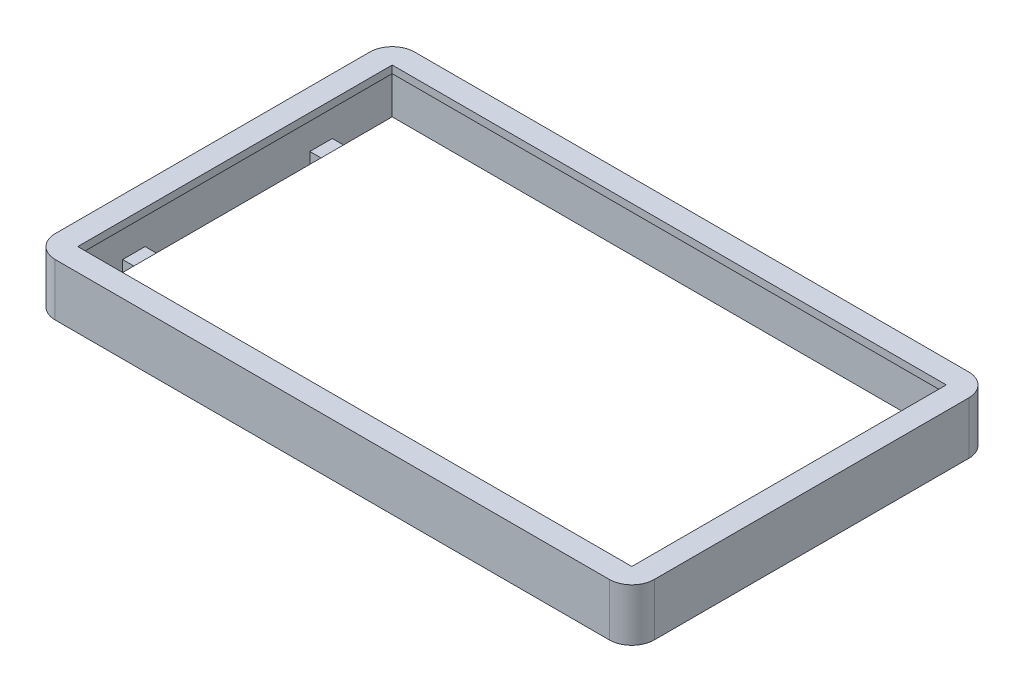
ISO-10303-21;
HEADER;
FILE_DESCRIPTION(('STEP AP214'),'2;1');
FILE_NAME('part.step','',(''),(''),'','','');
FILE_SCHEMA(('AUTOMOTIVE_DESIGN { 1 0 10303 214 1 1 1 1 }'));
ENDSEC;
DATA;
#1=APPLICATION_CONTEXT('core data for automotive mechanical design processes');
#2=APPLICATION_PROTOCOL_DEFINITION('international standard','automotive_design',2000,#1);
#3=PRODUCT_CONTEXT('',#1,'mechanical');
#4=PRODUCT('Part','Part','',(#3));
#5=PRODUCT_RELATED_PRODUCT_CATEGORY('part','',(#4));
#6=PRODUCT_DEFINITION_FORMATION('','',#4);
#7=PRODUCT_DEFINITION_CONTEXT('part definition',#1,'design');
#8=PRODUCT_DEFINITION('design','',#6,#7);
#9=PRODUCT_DEFINITION_SHAPE('','',#8);
#10=(LENGTH_UNIT() NAMED_UNIT(*) SI_UNIT(.MILLI.,.METRE.));
#11=(NAMED_UNIT(*) PLANE_ANGLE_UNIT() SI_UNIT($,.RADIAN.));
#12=(NAMED_UNIT(*) SI_UNIT($,.STERADIAN.) SOLID_ANGLE_UNIT());
#13=UNCERTAINTY_MEASURE_WITH_UNIT(LENGTH_MEASURE(1.E-05),#10,'distance_accuracy_value','');
#14=(GEOMETRIC_REPRESENTATION_CONTEXT(3) GLOBAL_UNCERTAINTY_ASSIGNED_CONTEXT((#13)) GLOBAL_UNIT_ASSIGNED_CONTEXT((#10,
#11,#12)) REPRESENTATION_CONTEXT('',''));
#15=CARTESIAN_POINT('',(0.,0.,0.));
#16=DIRECTION('',(0.,0.,1.));
#17=DIRECTION('',(1.,0.,0.));
#18=AXIS2_PLACEMENT_3D('',#15,#16,#17);
#19=CARTESIAN_POINT('',(0.,0.,0.));
#20=DIRECTION('',(0.,-1.,0.));
#21=DIRECTION('',(0.,0.,-1.));
#22=AXIS2_PLACEMENT_3D('',#19,#20,#21);
#23=PLANE('',#22);
#24=DIRECTION('',(-1.,0.,0.));
#25=VECTOR('',#24,1.);
#26=CARTESIAN_POINT('',(-40.,0.,-24.));
#27=LINE('',#26,#25);
#28=CARTESIAN_POINT('',(37.,0.,-24.));
#29=VERTEX_POINT('',#28);
#30=CARTESIAN_POINT('',(-37.,0.,-24.));
#31=VERTEX_POINT('',#30);
#32=EDGE_CURVE('E498',#29,#31,#27,.T.);
#33=ORIENTED_EDGE('',*,*,#32,.F.);
#34=CARTESIAN_POINT('',(37.,0.,-21.));
#35=DIRECTION('',(0.,-1.,0.));
#36=DIRECTION('',(0.,0.,-1.));
#37=AXIS2_PLACEMENT_3D('',#34,#35,#36);
#38=CIRCLE('',#37,3.);
#39=CARTESIAN_POINT('',(40.,0.,-21.));
#40=VERTEX_POINT('',#39);
#41=EDGE_CURVE('E529',#29,#40,#38,.T.);
#42=ORIENTED_EDGE('',*,*,#41,.T.);
#43=DIRECTION('',(0.,0.,-1.));
#44=VECTOR('',#43,1.);
#45=CARTESIAN_POINT('',(40.,0.,-24.));
#46=LINE('',#45,#44);
#47=CARTESIAN_POINT('',(40.,0.,21.));
#48=VERTEX_POINT('',#47);
#49=EDGE_CURVE('E510',#48,#40,#46,.T.);
#50=ORIENTED_EDGE('',*,*,#49,.F.);
#51=CARTESIAN_POINT('',(37.,0.,21.));
#52=DIRECTION('',(0.,-1.,0.));
#53=DIRECTION('',(0.,0.,-1.));
#54=AXIS2_PLACEMENT_3D('',#51,#52,#53);
#55=CIRCLE('',#54,3.);
#56=CARTESIAN_POINT('',(37.,0.,24.));
#57=VERTEX_POINT('',#56);
#58=EDGE_CURVE('E526',#48,#57,#55,.T.);
#59=ORIENTED_EDGE('',*,*,#58,.T.);
#60=DIRECTION('',(1.,0.,0.));
#61=VECTOR('',#60,1.);
#62=CARTESIAN_POINT('',(-40.,0.,24.));
#63=LINE('',#62,#61);
#64=CARTESIAN_POINT('',(-37.,0.,24.));
#65=VERTEX_POINT('',#64);
#66=EDGE_CURVE('E506',#65,#57,#63,.T.);
#67=ORIENTED_EDGE('',*,*,#66,.F.);
#68=CARTESIAN_POINT('',(-37.,0.,21.));
#69=DIRECTION('',(0.,-1.,0.));
#70=DIRECTION('',(0.,0.,-1.));
#71=AXIS2_PLACEMENT_3D('',#68,#69,#70);
#72=CIRCLE('',#71,3.);
#73=CARTESIAN_POINT('',(-40.,0.,21.));
#74=VERTEX_POINT('',#73);
#75=EDGE_CURVE('E523',#65,#74,#72,.T.);
#76=ORIENTED_EDGE('',*,*,#75,.T.);
#77=DIRECTION('',(0.,0.,1.));
#78=VECTOR('',#77,1.);
#79=CARTESIAN_POINT('',(-40.,0.,-24.));
#80=LINE('',#79,#78);
#81=CARTESIAN_POINT('',(-40.,0.,-21.));
#82=VERTEX_POINT('',#81);
#83=EDGE_CURVE('E502',#82,#74,#80,.T.);
#84=ORIENTED_EDGE('',*,*,#83,.F.);
#85=CARTESIAN_POINT('',(-37.,0.,-21.));
#86=DIRECTION('',(0.,-1.,0.));
#87=DIRECTION('',(0.,0.,-1.));
#88=AXIS2_PLACEMENT_3D('',#85,#86,#87);
#89=CIRCLE('',#88,3.);
#90=EDGE_CURVE('E520',#82,#31,#89,.T.);
#91=ORIENTED_EDGE('',*,*,#90,.T.);
#92=EDGE_LOOP('',(#33,#42,#50,#59,#67,#76,#84,#91));
#93=FACE_BOUND('',#92,.T.);
#94=DIRECTION('',(1.,0.,0.));
#95=VECTOR('',#94,1.);
#96=CARTESIAN_POINT('',(-38.,0.,22.));
#97=LINE('',#96,#95);
#98=CARTESIAN_POINT('',(-21.,0.,22.));
#99=VERTEX_POINT('',#98);
#100=CARTESIAN_POINT('',(21.,0.,22.));
#101=VERTEX_POINT('',#100);
#102=EDGE_CURVE('E486',#99,#101,#97,.T.);
#103=ORIENTED_EDGE('',*,*,#102,.T.);
#104=DIRECTION('',(1.,0.,0.));
#105=VECTOR('',#104,1.);
#106=CARTESIAN_POINT('',(26.,0.,22.));
#107=LINE('',#106,#105);
#108=CARTESIAN_POINT('',(26.,0.,22.));
#109=VERTEX_POINT('',#108);
#110=EDGE_CURVE('E576',#101,#109,#107,.T.);
#111=ORIENTED_EDGE('',*,*,#110,.T.);
#112=CARTESIAN_POINT('',(38.,0.,22.));
#113=VERTEX_POINT('',#112);
#114=EDGE_CURVE('E481',#109,#113,#97,.T.);
#115=ORIENTED_EDGE('',*,*,#114,.T.);
#116=DIRECTION('',(0.,0.,-1.));
#117=VECTOR('',#116,1.);
#118=CARTESIAN_POINT('',(38.,0.,-22.));
#119=LINE('',#118,#117);
#120=CARTESIAN_POINT('',(38.,0.,-22.));
#121=VERTEX_POINT('',#120);
#122=EDGE_CURVE('E451',#113,#121,#119,.T.);
#123=ORIENTED_EDGE('',*,*,#122,.T.);
#124=DIRECTION('',(-1.,0.,0.));
#125=VECTOR('',#124,1.);
#126=CARTESIAN_POINT('',(-38.,0.,-22.));
#127=LINE('',#126,#125);
#128=CARTESIAN_POINT('',(-38.,0.,-22.));
#129=VERTEX_POINT('',#128);
#130=EDGE_CURVE('E473',#121,#129,#127,.T.);
#131=ORIENTED_EDGE('',*,*,#130,.T.);
#132=DIRECTION('',(0.,0.,1.));
#133=VECTOR('',#132,1.);
#134=CARTESIAN_POINT('',(-38.,0.,-22.));
#135=LINE('',#134,#133);
#136=CARTESIAN_POINT('',(-38.,0.,-14.));
#137=VERTEX_POINT('',#136);
#138=EDGE_CURVE('E478',#129,#137,#135,.T.);
#139=ORIENTED_EDGE('',*,*,#138,.T.);
#140=DIRECTION('',(0.,0.,1.));
#141=VECTOR('',#140,1.);
#142=CARTESIAN_POINT('',(-38.,0.,0.));
#143=LINE('',#142,#141);
#144=CARTESIAN_POINT('',(-38.,0.,-11.));
#145=VERTEX_POINT('',#144);
#146=EDGE_CURVE('E568',#137,#145,#143,.T.);
#147=ORIENTED_EDGE('',*,*,#146,.T.);
#148=CARTESIAN_POINT('',(-38.,0.,11.));
#149=VERTEX_POINT('',#148);
#150=EDGE_CURVE('E482',#145,#149,#135,.T.);
#151=ORIENTED_EDGE('',*,*,#150,.T.);
#152=DIRECTION('',(0.,0.,1.));
#153=VECTOR('',#152,1.);
#154=CARTESIAN_POINT('',(-38.,0.,14.));
#155=LINE('',#154,#153);
#156=CARTESIAN_POINT('',(-38.,0.,14.));
#157=VERTEX_POINT('',#156);
#158=EDGE_CURVE('E565',#149,#157,#155,.T.);
#159=ORIENTED_EDGE('',*,*,#158,.T.);
#160=CARTESIAN_POINT('',(-38.,0.,22.));
#161=VERTEX_POINT('',#160);
#162=EDGE_CURVE('E477',#157,#161,#135,.T.);
#163=ORIENTED_EDGE('',*,*,#162,.T.);
#164=CARTESIAN_POINT('',(-26.,0.,22.));
#165=VERTEX_POINT('',#164);
#166=EDGE_CURVE('E457',#161,#165,#97,.T.);
#167=ORIENTED_EDGE('',*,*,#166,.T.);
#168=DIRECTION('',(1.,0.,0.));
#169=VECTOR('',#168,1.);
#170=CARTESIAN_POINT('',(0.,0.,22.));
#171=LINE('',#170,#169);
#172=EDGE_CURVE('E572',#165,#99,#171,.T.);
#173=ORIENTED_EDGE('',*,*,#172,.T.);
#174=EDGE_LOOP('',(#103,#111,#115,#123,#131,#139,#147,#151,#159,#163,#167,#173));
#175=FACE_BOUND('',#174,.T.);
#176=ADVANCED_FACE('F169',(#93,#175),#23,.T.);
#177=CARTESIAN_POINT('',(-40.,6.,-24.));
#178=DIRECTION('',(0.,0.,1.));
#179=DIRECTION('',(1.,0.,0.));
#180=AXIS2_PLACEMENT_3D('',#177,#178,#179);
#181=PLANE('',#180);
#182=DIRECTION('',(0.,-1.,0.));
#183=VECTOR('',#182,1.);
#184=CARTESIAN_POINT('',(-37.,6.,-24.));
#185=LINE('',#184,#183);
#186=CARTESIAN_POINT('',(-37.,7.,-24.));
#187=VERTEX_POINT('',#186);
#188=EDGE_CURVE('E514',#31,#187,#185,.F.);
#189=ORIENTED_EDGE('',*,*,#188,.T.);
#190=DIRECTION('',(-1.,0.,0.));
#191=VECTOR('',#190,1.);
#192=CARTESIAN_POINT('',(40.,7.,-24.));
#193=LINE('',#192,#191);
#194=CARTESIAN_POINT('',(37.,7.,-24.));
#195=VERTEX_POINT('',#194);
#196=EDGE_CURVE('E439',#195,#187,#193,.T.);
#197=ORIENTED_EDGE('',*,*,#196,.F.);
#198=DIRECTION('',(0.,-1.,0.));
#199=VECTOR('',#198,1.);
#200=CARTESIAN_POINT('',(37.,6.,-24.));
#201=LINE('',#200,#199);
#202=EDGE_CURVE('E517',#195,#29,#201,.T.);
#203=ORIENTED_EDGE('',*,*,#202,.T.);
#204=ORIENTED_EDGE('',*,*,#32,.T.);
#205=EDGE_LOOP('',(#189,#197,#203,#204));
#206=FACE_BOUND('',#205,.T.);
#207=ADVANCED_FACE('F687',(#206),#181,.F.);
#208=CARTESIAN_POINT('',(-40.,6.,-24.));
#209=DIRECTION('',(1.,0.,0.));
#210=DIRECTION('',(0.,0.,-1.));
#211=AXIS2_PLACEMENT_3D('',#208,#209,#210);
#212=PLANE('',#211);
#213=DIRECTION('',(0.,-1.,0.));
#214=VECTOR('',#213,1.);
#215=CARTESIAN_POINT('',(-40.,6.,21.));
#216=LINE('',#215,#214);
#217=CARTESIAN_POINT('',(-40.,7.,21.));
#218=VERTEX_POINT('',#217);
#219=EDGE_CURVE('E559',#74,#218,#216,.F.);
#220=ORIENTED_EDGE('',*,*,#219,.T.);
#221=DIRECTION('',(0.,0.,1.));
#222=VECTOR('',#221,1.);
#223=CARTESIAN_POINT('',(-40.,7.,-24.));
#224=LINE('',#223,#222);
#225=CARTESIAN_POINT('',(-40.,7.,-21.));
#226=VERTEX_POINT('',#225);
#227=EDGE_CURVE('E443',#226,#218,#224,.T.);
#228=ORIENTED_EDGE('',*,*,#227,.F.);
#229=DIRECTION('',(0.,-1.,0.));
#230=VECTOR('',#229,1.);
#231=CARTESIAN_POINT('',(-40.,6.,-21.));
#232=LINE('',#231,#230);
#233=EDGE_CURVE('E556',#226,#82,#232,.T.);
#234=ORIENTED_EDGE('',*,*,#233,.T.);
#235=ORIENTED_EDGE('',*,*,#83,.T.);
#236=EDGE_LOOP('',(#220,#228,#234,#235));
#237=FACE_BOUND('',#236,.T.);
#238=ADVANCED_FACE('F695',(#237),#212,.F.);
#239=CARTESIAN_POINT('',(-40.,6.,24.));
#240=DIRECTION('',(0.,0.,-1.));
#241=DIRECTION('',(-1.,0.,0.));
#242=AXIS2_PLACEMENT_3D('',#239,#240,#241);
#243=PLANE('',#242);
#244=DIRECTION('',(0.,-1.,0.));
#245=VECTOR('',#244,1.);
#246=CARTESIAN_POINT('',(37.,6.,24.));
#247=LINE('',#246,#245);
#248=CARTESIAN_POINT('',(37.,7.,24.));
#249=VERTEX_POINT('',#248);
#250=EDGE_CURVE('E553',#57,#249,#247,.F.);
#251=ORIENTED_EDGE('',*,*,#250,.T.);
#252=DIRECTION('',(1.,0.,0.));
#253=VECTOR('',#252,1.);
#254=CARTESIAN_POINT('',(-40.,7.,24.));
#255=LINE('',#254,#253);
#256=CARTESIAN_POINT('',(-37.,7.,24.));
#257=VERTEX_POINT('',#256);
#258=EDGE_CURVE('E447',#257,#249,#255,.T.);
#259=ORIENTED_EDGE('',*,*,#258,.F.);
#260=DIRECTION('',(0.,-1.,0.));
#261=VECTOR('',#260,1.);
#262=CARTESIAN_POINT('',(-37.,6.,24.));
#263=LINE('',#262,#261);
#264=EDGE_CURVE('E550',#257,#65,#263,.T.);
#265=ORIENTED_EDGE('',*,*,#264,.T.);
#266=ORIENTED_EDGE('',*,*,#66,.T.);
#267=EDGE_LOOP('',(#251,#259,#265,#266));
#268=FACE_BOUND('',#267,.T.);
#269=ADVANCED_FACE('F706',(#268),#243,.F.);
#270=CARTESIAN_POINT('',(40.,6.,-24.));
#271=DIRECTION('',(-1.,0.,0.));
#272=DIRECTION('',(0.,0.,1.));
#273=AXIS2_PLACEMENT_3D('',#270,#271,#272);
#274=PLANE('',#273);
#275=DIRECTION('',(0.,-1.,0.));
#276=VECTOR('',#275,1.);
#277=CARTESIAN_POINT('',(40.,6.,-21.));
#278=LINE('',#277,#276);
#279=CARTESIAN_POINT('',(40.,7.,-21.));
#280=VERTEX_POINT('',#279);
#281=EDGE_CURVE('E535',#40,#280,#278,.F.);
#282=ORIENTED_EDGE('',*,*,#281,.T.);
#283=DIRECTION('',(0.,0.,-1.));
#284=VECTOR('',#283,1.);
#285=CARTESIAN_POINT('',(40.,7.,24.));
#286=LINE('',#285,#284);
#287=CARTESIAN_POINT('',(40.,7.,21.));
#288=VERTEX_POINT('',#287);
#289=EDGE_CURVE('E435',#288,#280,#286,.T.);
#290=ORIENTED_EDGE('',*,*,#289,.F.);
#291=DIRECTION('',(0.,-1.,0.));
#292=VECTOR('',#291,1.);
#293=CARTESIAN_POINT('',(40.,6.,21.));
#294=LINE('',#293,#292);
#295=EDGE_CURVE('E532',#288,#48,#294,.T.);
#296=ORIENTED_EDGE('',*,*,#295,.T.);
#297=ORIENTED_EDGE('',*,*,#49,.T.);
#298=EDGE_LOOP('',(#282,#290,#296,#297));
#299=FACE_BOUND('',#298,.T.);
#300=ADVANCED_FACE('F703',(#299),#274,.F.);
#301=CARTESIAN_POINT('',(38.,6.,-22.));
#302=DIRECTION('',(-1.,0.,0.));
#303=DIRECTION('',(0.,0.,1.));
#304=AXIS2_PLACEMENT_3D('',#301,#302,#303);
#305=PLANE('',#304);
#306=ORIENTED_EDGE('',*,*,#122,.F.);
#307=DIRECTION('',(0.,-1.,0.));
#308=VECTOR('',#307,1.);
#309=CARTESIAN_POINT('',(38.,6.,22.));
#310=LINE('',#309,#308);
#311=CARTESIAN_POINT('',(38.,6.,22.));
#312=VERTEX_POINT('',#311);
#313=EDGE_CURVE('E469',#312,#113,#310,.T.);
#314=ORIENTED_EDGE('',*,*,#313,.F.);
#315=DIRECTION('',(0.,0.,-1.));
#316=VECTOR('',#315,1.);
#317=CARTESIAN_POINT('',(38.,6.,-22.));
#318=LINE('',#317,#316);
#319=CARTESIAN_POINT('',(38.,6.,-22.));
#320=VERTEX_POINT('',#319);
#321=EDGE_CURVE('E452',#312,#320,#318,.T.);
#322=ORIENTED_EDGE('',*,*,#321,.T.);
#323=DIRECTION('',(0.,-1.,0.));
#324=VECTOR('',#323,1.);
#325=CARTESIAN_POINT('',(38.,6.,-22.));
#326=LINE('',#325,#324);
#327=EDGE_CURVE('E495',#320,#121,#326,.T.);
#328=ORIENTED_EDGE('',*,*,#327,.T.);
#329=EDGE_LOOP('',(#306,#314,#322,#328));
#330=FACE_BOUND('',#329,.T.);
#331=ADVANCED_FACE('F701',(#330),#305,.T.);
#332=CARTESIAN_POINT('',(-38.,6.,-22.));
#333=DIRECTION('',(0.,0.,1.));
#334=DIRECTION('',(1.,0.,0.));
#335=AXIS2_PLACEMENT_3D('',#332,#333,#334);
#336=PLANE('',#335);
#337=ORIENTED_EDGE('',*,*,#130,.F.);
#338=ORIENTED_EDGE('',*,*,#327,.F.);
#339=DIRECTION('',(-1.,0.,0.));
#340=VECTOR('',#339,1.);
#341=CARTESIAN_POINT('',(-38.,6.,-22.));
#342=LINE('',#341,#340);
#343=CARTESIAN_POINT('',(-38.,6.,-22.));
#344=VERTEX_POINT('',#343);
#345=EDGE_CURVE('E456',#320,#344,#342,.T.);
#346=ORIENTED_EDGE('',*,*,#345,.T.);
#347=DIRECTION('',(0.,-1.,0.));
#348=VECTOR('',#347,1.);
#349=CARTESIAN_POINT('',(-38.,6.,-22.));
#350=LINE('',#349,#348);
#351=EDGE_CURVE('E492',#344,#129,#350,.T.);
#352=ORIENTED_EDGE('',*,*,#351,.T.);
#353=EDGE_LOOP('',(#337,#338,#346,#352));
#354=FACE_BOUND('',#353,.T.);
#355=ADVANCED_FACE('F786',(#354),#336,.T.);
#356=CARTESIAN_POINT('',(-38.,6.,-22.));
#357=DIRECTION('',(1.,0.,0.));
#358=DIRECTION('',(0.,0.,-1.));
#359=AXIS2_PLACEMENT_3D('',#356,#357,#358);
#360=PLANE('',#359);
#361=ORIENTED_EDGE('',*,*,#138,.F.);
#362=ORIENTED_EDGE('',*,*,#351,.F.);
#363=DIRECTION('',(0.,0.,1.));
#364=VECTOR('',#363,1.);
#365=CARTESIAN_POINT('',(-38.,6.,-22.));
#366=LINE('',#365,#364);
#367=CARTESIAN_POINT('',(-38.,6.,22.));
#368=VERTEX_POINT('',#367);
#369=EDGE_CURVE('E461',#344,#368,#366,.T.);
#370=ORIENTED_EDGE('',*,*,#369,.T.);
#371=DIRECTION('',(0.,-1.,0.));
#372=VECTOR('',#371,1.);
#373=CARTESIAN_POINT('',(-38.,6.,22.));
#374=LINE('',#373,#372);
#375=EDGE_CURVE('E489',#368,#161,#374,.T.);
#376=ORIENTED_EDGE('',*,*,#375,.T.);
#377=ORIENTED_EDGE('',*,*,#162,.F.);
#378=DIRECTION('',(0.,-1.,0.));
#379=VECTOR('',#378,1.);
#380=CARTESIAN_POINT('',(-38.,1.5,14.));
#381=LINE('',#380,#379);
#382=CARTESIAN_POINT('',(-38.,1.5,14.));
#383=VERTEX_POINT('',#382);
#384=EDGE_CURVE('E607',#383,#157,#381,.T.);
#385=ORIENTED_EDGE('',*,*,#384,.F.);
#386=DIRECTION('',(0.,0.,-1.));
#387=VECTOR('',#386,1.);
#388=CARTESIAN_POINT('',(-38.,1.5,-22.));
#389=LINE('',#388,#387);
#390=CARTESIAN_POINT('',(-38.,1.5,11.));
#391=VERTEX_POINT('',#390);
#392=EDGE_CURVE('E382',#383,#391,#389,.T.);
#393=ORIENTED_EDGE('',*,*,#392,.T.);
#394=DIRECTION('',(0.,-1.,0.));
#395=VECTOR('',#394,1.);
#396=CARTESIAN_POINT('',(-38.,1.5,11.));
#397=LINE('',#396,#395);
#398=EDGE_CURVE('E597',#391,#149,#397,.T.);
#399=ORIENTED_EDGE('',*,*,#398,.T.);
#400=ORIENTED_EDGE('',*,*,#150,.F.);
#401=DIRECTION('',(0.,-1.,0.));
#402=VECTOR('',#401,1.);
#403=CARTESIAN_POINT('',(-38.,1.5,-11.));
#404=LINE('',#403,#402);
#405=CARTESIAN_POINT('',(-38.,1.5,-11.));
#406=VERTEX_POINT('',#405);
#407=EDGE_CURVE('E368',#406,#145,#404,.T.);
#408=ORIENTED_EDGE('',*,*,#407,.F.);
#409=CARTESIAN_POINT('',(-38.,1.5,-14.));
#410=VERTEX_POINT('',#409);
#411=EDGE_CURVE('E373',#406,#410,#389,.T.);
#412=ORIENTED_EDGE('',*,*,#411,.T.);
#413=DIRECTION('',(0.,-1.,0.));
#414=VECTOR('',#413,1.);
#415=CARTESIAN_POINT('',(-38.,1.5,-14.));
#416=LINE('',#415,#414);
#417=EDGE_CURVE('E357',#410,#137,#416,.T.);
#418=ORIENTED_EDGE('',*,*,#417,.T.);
#419=EDGE_LOOP('',(#361,#362,#370,#376,#377,#385,#393,#399,#400,#408,#412,#418));
#420=FACE_BOUND('',#419,.T.);
#421=ADVANCED_FACE('F379',(#420),#360,.T.);
#422=CARTESIAN_POINT('',(-38.,6.,22.));
#423=DIRECTION('',(0.,0.,-1.));
#424=DIRECTION('',(-1.,0.,0.));
#425=AXIS2_PLACEMENT_3D('',#422,#423,#424);
#426=PLANE('',#425);
#427=ORIENTED_EDGE('',*,*,#166,.F.);
#428=ORIENTED_EDGE('',*,*,#375,.F.);
#429=DIRECTION('',(1.,0.,0.));
#430=VECTOR('',#429,1.);
#431=CARTESIAN_POINT('',(-38.,6.,22.));
#432=LINE('',#431,#430);
#433=EDGE_CURVE('E465',#368,#312,#432,.T.);
#434=ORIENTED_EDGE('',*,*,#433,.T.);
#435=ORIENTED_EDGE('',*,*,#313,.T.);
#436=ORIENTED_EDGE('',*,*,#114,.F.);
#437=DIRECTION('',(0.,-1.,0.));
#438=VECTOR('',#437,1.);
#439=CARTESIAN_POINT('',(26.,1.5,22.));
#440=LINE('',#439,#438);
#441=CARTESIAN_POINT('',(26.,1.5,22.));
#442=VERTEX_POINT('',#441);
#443=EDGE_CURVE('E649',#442,#109,#440,.T.);
#444=ORIENTED_EDGE('',*,*,#443,.F.);
#445=DIRECTION('',(-1.,0.,0.));
#446=VECTOR('',#445,1.);
#447=CARTESIAN_POINT('',(-38.,1.5,22.));
#448=LINE('',#447,#446);
#449=CARTESIAN_POINT('',(21.,1.5,22.));
#450=VERTEX_POINT('',#449);
#451=EDGE_CURVE('E383',#442,#450,#448,.T.);
#452=ORIENTED_EDGE('',*,*,#451,.T.);
#453=DIRECTION('',(0.,-1.,0.));
#454=VECTOR('',#453,1.);
#455=CARTESIAN_POINT('',(21.,1.5,22.));
#456=LINE('',#455,#454);
#457=EDGE_CURVE('E653',#450,#101,#456,.T.);
#458=ORIENTED_EDGE('',*,*,#457,.T.);
#459=ORIENTED_EDGE('',*,*,#102,.F.);
#460=DIRECTION('',(0.,-1.,0.));
#461=VECTOR('',#460,1.);
#462=CARTESIAN_POINT('',(-21.,1.5,22.));
#463=LINE('',#462,#461);
#464=CARTESIAN_POINT('',(-21.,1.5,22.));
#465=VERTEX_POINT('',#464);
#466=EDGE_CURVE('E657',#465,#99,#463,.T.);
#467=ORIENTED_EDGE('',*,*,#466,.F.);
#468=CARTESIAN_POINT('',(-26.,1.5,22.));
#469=VERTEX_POINT('',#468);
#470=EDGE_CURVE('E390',#465,#469,#448,.T.);
#471=ORIENTED_EDGE('',*,*,#470,.T.);
#472=DIRECTION('',(0.,-1.,0.));
#473=VECTOR('',#472,1.);
#474=CARTESIAN_POINT('',(-26.,1.5,22.));
#475=LINE('',#474,#473);
#476=EDGE_CURVE('E661',#469,#165,#475,.T.);
#477=ORIENTED_EDGE('',*,*,#476,.T.);
#478=EDGE_LOOP('',(#427,#428,#434,#435,#436,#444,#452,#458,#459,#467,#471,#477));
#479=FACE_BOUND('',#478,.T.);
#480=ADVANCED_FACE('F760',(#479),#426,.T.);
#481=CARTESIAN_POINT('',(0.,7.,0.));
#482=DIRECTION('',(0.,1.,0.));
#483=DIRECTION('',(0.,0.,1.));
#484=AXIS2_PLACEMENT_3D('',#481,#482,#483);
#485=PLANE('',#484);
#486=ORIENTED_EDGE('',*,*,#289,.T.);
#487=CARTESIAN_POINT('',(37.,7.,-21.));
#488=DIRECTION('',(0.,1.,0.));
#489=DIRECTION('',(0.,0.,1.));
#490=AXIS2_PLACEMENT_3D('',#487,#488,#489);
#491=CIRCLE('',#490,3.);
#492=EDGE_CURVE('E547',#280,#195,#491,.T.);
#493=ORIENTED_EDGE('',*,*,#492,.T.);
#494=ORIENTED_EDGE('',*,*,#196,.T.);
#495=CARTESIAN_POINT('',(-37.,7.,-21.));
#496=DIRECTION('',(0.,1.,0.));
#497=DIRECTION('',(0.,0.,1.));
#498=AXIS2_PLACEMENT_3D('',#495,#496,#497);
#499=CIRCLE('',#498,3.);
#500=EDGE_CURVE('E538',#187,#226,#499,.T.);
#501=ORIENTED_EDGE('',*,*,#500,.T.);
#502=ORIENTED_EDGE('',*,*,#227,.T.);
#503=CARTESIAN_POINT('',(-37.,7.,21.));
#504=DIRECTION('',(0.,1.,0.));
#505=DIRECTION('',(0.,0.,1.));
#506=AXIS2_PLACEMENT_3D('',#503,#504,#505);
#507=CIRCLE('',#506,3.);
#508=EDGE_CURVE('E541',#218,#257,#507,.T.);
#509=ORIENTED_EDGE('',*,*,#508,.T.);
#510=ORIENTED_EDGE('',*,*,#258,.T.);
#511=CARTESIAN_POINT('',(37.,7.,21.));
#512=DIRECTION('',(0.,1.,0.));
#513=DIRECTION('',(0.,0.,1.));
#514=AXIS2_PLACEMENT_3D('',#511,#512,#513);
#515=CIRCLE('',#514,3.);
#516=EDGE_CURVE('E544',#249,#288,#515,.T.);
#517=ORIENTED_EDGE('',*,*,#516,.T.);
#518=EDGE_LOOP('',(#486,#493,#494,#501,#502,#509,#510,#517));
#519=FACE_BOUND('',#518,.T.);
#520=DIRECTION('',(-1.,0.,0.));
#521=VECTOR('',#520,1.);
#522=CARTESIAN_POINT('',(37.,7.,-21.));
#523=LINE('',#522,#521);
#524=CARTESIAN_POINT('',(37.,7.,-21.));
#525=VERTEX_POINT('',#524);
#526=CARTESIAN_POINT('',(-37.,7.,-21.));
#527=VERTEX_POINT('',#526);
#528=EDGE_CURVE('E396',#525,#527,#523,.T.);
#529=ORIENTED_EDGE('',*,*,#528,.F.);
#530=DIRECTION('',(0.,0.,-1.));
#531=VECTOR('',#530,1.);
#532=CARTESIAN_POINT('',(37.,7.,21.));
#533=LINE('',#532,#531);
#534=CARTESIAN_POINT('',(37.,7.,21.));
#535=VERTEX_POINT('',#534);
#536=EDGE_CURVE('E393',#535,#525,#533,.T.);
#537=ORIENTED_EDGE('',*,*,#536,.F.);
#538=DIRECTION('',(1.,0.,0.));
#539=VECTOR('',#538,1.);
#540=CARTESIAN_POINT('',(-37.,7.,21.));
#541=LINE('',#540,#539);
#542=CARTESIAN_POINT('',(-37.,7.,21.));
#543=VERTEX_POINT('',#542);
#544=EDGE_CURVE('E404',#543,#535,#541,.T.);
#545=ORIENTED_EDGE('',*,*,#544,.F.);
#546=DIRECTION('',(0.,0.,1.));
#547=VECTOR('',#546,1.);
#548=CARTESIAN_POINT('',(-37.,7.,-21.));
#549=LINE('',#548,#547);
#550=EDGE_CURVE('E400',#527,#543,#549,.T.);
#551=ORIENTED_EDGE('',*,*,#550,.F.);
#552=EDGE_LOOP('',(#529,#537,#545,#551));
#553=FACE_BOUND('',#552,.T.);
#554=ADVANCED_FACE('F791',(#519,#553),#485,.T.);
#555=CARTESIAN_POINT('',(0.,6.,0.));
#556=DIRECTION('',(0.,1.,0.));
#557=DIRECTION('',(0.,0.,1.));
#558=AXIS2_PLACEMENT_3D('',#555,#556,#557);
#559=PLANE('',#558);
#560=ORIENTED_EDGE('',*,*,#321,.F.);
#561=ORIENTED_EDGE('',*,*,#433,.F.);
#562=ORIENTED_EDGE('',*,*,#369,.F.);
#563=ORIENTED_EDGE('',*,*,#345,.F.);
#564=EDGE_LOOP('',(#560,#561,#562,#563));
#565=FACE_BOUND('',#564,.T.);
#566=DIRECTION('',(0.,0.,-1.));
#567=VECTOR('',#566,1.);
#568=CARTESIAN_POINT('',(37.,6.,21.));
#569=LINE('',#568,#567);
#570=CARTESIAN_POINT('',(37.,6.,21.));
#571=VERTEX_POINT('',#570);
#572=CARTESIAN_POINT('',(37.,6.,-21.));
#573=VERTEX_POINT('',#572);
#574=EDGE_CURVE('E388',#571,#573,#569,.T.);
#575=ORIENTED_EDGE('',*,*,#574,.T.);
#576=DIRECTION('',(-1.,0.,0.));
#577=VECTOR('',#576,1.);
#578=CARTESIAN_POINT('',(37.,6.,-21.));
#579=LINE('',#578,#577);
#580=CARTESIAN_POINT('',(-37.,6.,-21.));
#581=VERTEX_POINT('',#580);
#582=EDGE_CURVE('E411',#573,#581,#579,.T.);
#583=ORIENTED_EDGE('',*,*,#582,.T.);
#584=DIRECTION('',(0.,0.,1.));
#585=VECTOR('',#584,1.);
#586=CARTESIAN_POINT('',(-37.,6.,-21.));
#587=LINE('',#586,#585);
#588=CARTESIAN_POINT('',(-37.,6.,21.));
#589=VERTEX_POINT('',#588);
#590=EDGE_CURVE('E415',#581,#589,#587,.T.);
#591=ORIENTED_EDGE('',*,*,#590,.T.);
#592=DIRECTION('',(1.,0.,0.));
#593=VECTOR('',#592,1.);
#594=CARTESIAN_POINT('',(-37.,6.,21.));
#595=LINE('',#594,#593);
#596=EDGE_CURVE('E397',#589,#571,#595,.T.);
#597=ORIENTED_EDGE('',*,*,#596,.T.);
#598=EDGE_LOOP('',(#575,#583,#591,#597));
#599=FACE_BOUND('',#598,.T.);
#600=ADVANCED_FACE('F787',(#565,#599),#559,.F.);
#601=CARTESIAN_POINT('',(37.,7.,21.));
#602=DIRECTION('',(-1.,0.,0.));
#603=DIRECTION('',(0.,0.,1.));
#604=AXIS2_PLACEMENT_3D('',#601,#602,#603);
#605=PLANE('',#604);
#606=ORIENTED_EDGE('',*,*,#574,.F.);
#607=DIRECTION('',(0.,-1.,0.));
#608=VECTOR('',#607,1.);
#609=CARTESIAN_POINT('',(37.,7.,21.));
#610=LINE('',#609,#608);
#611=EDGE_CURVE('E407',#535,#571,#610,.T.);
#612=ORIENTED_EDGE('',*,*,#611,.F.);
#613=ORIENTED_EDGE('',*,*,#536,.T.);
#614=DIRECTION('',(0.,-1.,0.));
#615=VECTOR('',#614,1.);
#616=CARTESIAN_POINT('',(37.,7.,-21.));
#617=LINE('',#616,#615);
#618=EDGE_CURVE('E431',#525,#573,#617,.T.);
#619=ORIENTED_EDGE('',*,*,#618,.T.);
#620=EDGE_LOOP('',(#606,#612,#613,#619));
#621=FACE_BOUND('',#620,.T.);
#622=ADVANCED_FACE('F790',(#621),#605,.T.);
#623=CARTESIAN_POINT('',(37.,7.,-21.));
#624=DIRECTION('',(0.,0.,1.));
#625=DIRECTION('',(1.,0.,0.));
#626=AXIS2_PLACEMENT_3D('',#623,#624,#625);
#627=PLANE('',#626);
#628=ORIENTED_EDGE('',*,*,#582,.F.);
#629=ORIENTED_EDGE('',*,*,#618,.F.);
#630=ORIENTED_EDGE('',*,*,#528,.T.);
#631=DIRECTION('',(0.,-1.,0.));
#632=VECTOR('',#631,1.);
#633=CARTESIAN_POINT('',(-37.,7.,-21.));
#634=LINE('',#633,#632);
#635=EDGE_CURVE('E428',#527,#581,#634,.T.);
#636=ORIENTED_EDGE('',*,*,#635,.T.);
#637=EDGE_LOOP('',(#628,#629,#630,#636));
#638=FACE_BOUND('',#637,.T.);
#639=ADVANCED_FACE('F804',(#638),#627,.T.);
#640=CARTESIAN_POINT('',(-37.,7.,-21.));
#641=DIRECTION('',(1.,0.,0.));
#642=DIRECTION('',(0.,0.,-1.));
#643=AXIS2_PLACEMENT_3D('',#640,#641,#642);
#644=PLANE('',#643);
#645=ORIENTED_EDGE('',*,*,#590,.F.);
#646=ORIENTED_EDGE('',*,*,#635,.F.);
#647=ORIENTED_EDGE('',*,*,#550,.T.);
#648=DIRECTION('',(0.,-1.,0.));
#649=VECTOR('',#648,1.);
#650=CARTESIAN_POINT('',(-37.,7.,21.));
#651=LINE('',#650,#649);
#652=EDGE_CURVE('E425',#543,#589,#651,.T.);
#653=ORIENTED_EDGE('',*,*,#652,.T.);
#654=EDGE_LOOP('',(#645,#646,#647,#653));
#655=FACE_BOUND('',#654,.T.);
#656=ADVANCED_FACE('F808',(#655),#644,.T.);
#657=CARTESIAN_POINT('',(-37.,7.,21.));
#658=DIRECTION('',(0.,0.,-1.));
#659=DIRECTION('',(-1.,0.,0.));
#660=AXIS2_PLACEMENT_3D('',#657,#658,#659);
#661=PLANE('',#660);
#662=ORIENTED_EDGE('',*,*,#596,.F.);
#663=ORIENTED_EDGE('',*,*,#652,.F.);
#664=ORIENTED_EDGE('',*,*,#544,.T.);
#665=ORIENTED_EDGE('',*,*,#611,.T.);
#666=EDGE_LOOP('',(#662,#663,#664,#665));
#667=FACE_BOUND('',#666,.T.);
#668=ADVANCED_FACE('F718',(#667),#661,.T.);
#669=CARTESIAN_POINT('',(37.,6.,-21.));
#670=DIRECTION('',(0.,-1.,0.));
#671=DIRECTION('',(0.,0.,-1.));
#672=AXIS2_PLACEMENT_3D('',#669,#670,#671);
#673=CYLINDRICAL_SURFACE('',#672,3.);
#674=ORIENTED_EDGE('',*,*,#41,.F.);
#675=ORIENTED_EDGE('',*,*,#202,.F.);
#676=ORIENTED_EDGE('',*,*,#492,.F.);
#677=ORIENTED_EDGE('',*,*,#281,.F.);
#678=EDGE_LOOP('',(#674,#675,#676,#677));
#679=FACE_BOUND('',#678,.T.);
#680=ADVANCED_FACE('F714',(#679),#673,.T.);
#681=CARTESIAN_POINT('',(37.,6.,21.));
#682=DIRECTION('',(0.,-1.,0.));
#683=DIRECTION('',(0.,0.,-1.));
#684=AXIS2_PLACEMENT_3D('',#681,#682,#683);
#685=CYLINDRICAL_SURFACE('',#684,3.);
#686=ORIENTED_EDGE('',*,*,#58,.F.);
#687=ORIENTED_EDGE('',*,*,#295,.F.);
#688=ORIENTED_EDGE('',*,*,#516,.F.);
#689=ORIENTED_EDGE('',*,*,#250,.F.);
#690=EDGE_LOOP('',(#686,#687,#688,#689));
#691=FACE_BOUND('',#690,.T.);
#692=ADVANCED_FACE('F717',(#691),#685,.T.);
#693=CARTESIAN_POINT('',(-37.,6.,21.));
#694=DIRECTION('',(0.,-1.,0.));
#695=DIRECTION('',(0.,0.,-1.));
#696=AXIS2_PLACEMENT_3D('',#693,#694,#695);
#697=CYLINDRICAL_SURFACE('',#696,3.);
#698=ORIENTED_EDGE('',*,*,#75,.F.);
#699=ORIENTED_EDGE('',*,*,#264,.F.);
#700=ORIENTED_EDGE('',*,*,#508,.F.);
#701=ORIENTED_EDGE('',*,*,#219,.F.);
#702=EDGE_LOOP('',(#698,#699,#700,#701));
#703=FACE_BOUND('',#702,.T.);
#704=ADVANCED_FACE('F722',(#703),#697,.T.);
#705=CARTESIAN_POINT('',(-37.,6.,-21.));
#706=DIRECTION('',(0.,-1.,0.));
#707=DIRECTION('',(0.,0.,-1.));
#708=AXIS2_PLACEMENT_3D('',#705,#706,#707);
#709=CYLINDRICAL_SURFACE('',#708,3.);
#710=ORIENTED_EDGE('',*,*,#90,.F.);
#711=ORIENTED_EDGE('',*,*,#233,.F.);
#712=ORIENTED_EDGE('',*,*,#500,.F.);
#713=ORIENTED_EDGE('',*,*,#188,.F.);
#714=EDGE_LOOP('',(#710,#711,#712,#713));
#715=FACE_BOUND('',#714,.T.);
#716=ADVANCED_FACE('F726',(#715),#709,.T.);
#717=CARTESIAN_POINT('',(-26.,1.5,0.));
#718=DIRECTION('',(-1.,0.,0.));
#719=DIRECTION('',(0.,0.,1.));
#720=AXIS2_PLACEMENT_3D('',#717,#718,#719);
#721=PLANE('',#720);
#722=DIRECTION('',(0.,0.,-1.));
#723=VECTOR('',#722,1.);
#724=CARTESIAN_POINT('',(-26.,1.5,0.));
#725=LINE('',#724,#723);
#726=CARTESIAN_POINT('',(-26.,1.5,20.5));
#727=VERTEX_POINT('',#726);
#728=EDGE_CURVE('E621',#469,#727,#725,.T.);
#729=ORIENTED_EDGE('',*,*,#728,.T.);
#730=DIRECTION('',(0.,0.707106781186551,-0.707106781186544));
#731=VECTOR('',#730,1.);
#732=CARTESIAN_POINT('',(-26.,11.75,10.2500000000001));
#733=LINE('',#732,#731);
#734=EDGE_CURVE('E585',#727,#165,#733,.F.);
#735=ORIENTED_EDGE('',*,*,#734,.T.);
#736=ORIENTED_EDGE('',*,*,#476,.F.);
#737=EDGE_LOOP('',(#729,#735,#736));
#738=FACE_BOUND('',#737,.T.);
#739=ADVANCED_FACE('F729',(#738),#721,.T.);
#740=CARTESIAN_POINT('',(-21.,1.5,0.));
#741=DIRECTION('',(-1.,0.,0.));
#742=DIRECTION('',(0.,0.,1.));
#743=AXIS2_PLACEMENT_3D('',#740,#741,#742);
#744=PLANE('',#743);
#745=ORIENTED_EDGE('',*,*,#466,.T.);
#746=DIRECTION('',(0.,-0.707106781186551,0.707106781186544));
#747=VECTOR('',#746,1.);
#748=CARTESIAN_POINT('',(-21.,0.,22.));
#749=LINE('',#748,#747);
#750=CARTESIAN_POINT('',(-21.,1.5,20.5));
#751=VERTEX_POINT('',#750);
#752=EDGE_CURVE('E582',#99,#751,#749,.F.);
#753=ORIENTED_EDGE('',*,*,#752,.T.);
#754=DIRECTION('',(0.,0.,-1.));
#755=VECTOR('',#754,1.);
#756=CARTESIAN_POINT('',(-21.,1.5,0.));
#757=LINE('',#756,#755);
#758=EDGE_CURVE('E634',#465,#751,#757,.T.);
#759=ORIENTED_EDGE('',*,*,#758,.F.);
#760=EDGE_LOOP('',(#745,#753,#759));
#761=FACE_BOUND('',#760,.T.);
#762=ADVANCED_FACE('F771',(#761),#744,.F.);
#763=CARTESIAN_POINT('',(0.,1.5,0.));
#764=DIRECTION('',(0.,-1.,0.));
#765=DIRECTION('',(0.,0.,-1.));
#766=AXIS2_PLACEMENT_3D('',#763,#764,#765);
#767=PLANE('',#766);
#768=ORIENTED_EDGE('',*,*,#470,.F.);
#769=ORIENTED_EDGE('',*,*,#758,.T.);
#770=DIRECTION('',(1.,0.,0.));
#771=VECTOR('',#770,1.);
#772=CARTESIAN_POINT('',(0.,1.5,20.5));
#773=LINE('',#772,#771);
#774=EDGE_CURVE('E626',#727,#751,#773,.T.);
#775=ORIENTED_EDGE('',*,*,#774,.F.);
#776=ORIENTED_EDGE('',*,*,#728,.F.);
#777=EDGE_LOOP('',(#768,#769,#775,#776));
#778=FACE_BOUND('',#777,.T.);
#779=ADVANCED_FACE('F773',(#778),#767,.F.);
#780=ORIENTED_EDGE('',*,*,#451,.F.);
#781=DIRECTION('',(0.,0.,-1.));
#782=VECTOR('',#781,1.);
#783=CARTESIAN_POINT('',(26.,1.5,0.));
#784=LINE('',#783,#782);
#785=CARTESIAN_POINT('',(26.,1.5,20.5));
#786=VERTEX_POINT('',#785);
#787=EDGE_CURVE('E369',#442,#786,#784,.T.);
#788=ORIENTED_EDGE('',*,*,#787,.T.);
#789=DIRECTION('',(-1.,0.,0.));
#790=VECTOR('',#789,1.);
#791=CARTESIAN_POINT('',(0.,1.5,20.5));
#792=LINE('',#791,#790);
#793=CARTESIAN_POINT('',(21.,1.5,20.5));
#794=VERTEX_POINT('',#793);
#795=EDGE_CURVE('E642',#786,#794,#792,.T.);
#796=ORIENTED_EDGE('',*,*,#795,.T.);
#797=DIRECTION('',(0.,0.,-1.));
#798=VECTOR('',#797,1.);
#799=CARTESIAN_POINT('',(21.,1.5,0.));
#800=LINE('',#799,#798);
#801=EDGE_CURVE('E638',#450,#794,#800,.T.);
#802=ORIENTED_EDGE('',*,*,#801,.F.);
#803=EDGE_LOOP('',(#780,#788,#796,#802));
#804=FACE_BOUND('',#803,.T.);
#805=ADVANCED_FACE('F756',(#804),#767,.F.);
#806=CARTESIAN_POINT('',(21.,1.5,0.));
#807=DIRECTION('',(-1.,0.,0.));
#808=DIRECTION('',(0.,0.,1.));
#809=AXIS2_PLACEMENT_3D('',#806,#807,#808);
#810=PLANE('',#809);
#811=ORIENTED_EDGE('',*,*,#801,.T.);
#812=DIRECTION('',(0.,-0.707106781186548,0.707106781186548));
#813=VECTOR('',#812,1.);
#814=CARTESIAN_POINT('',(21.,11.75,10.25));
#815=LINE('',#814,#813);
#816=EDGE_CURVE('E562',#794,#101,#815,.T.);
#817=ORIENTED_EDGE('',*,*,#816,.T.);
#818=ORIENTED_EDGE('',*,*,#457,.F.);
#819=EDGE_LOOP('',(#811,#817,#818));
#820=FACE_BOUND('',#819,.T.);
#821=ADVANCED_FACE('F962',(#820),#810,.T.);
#822=CARTESIAN_POINT('',(26.,1.5,0.));
#823=DIRECTION('',(-1.,0.,0.));
#824=DIRECTION('',(0.,0.,1.));
#825=AXIS2_PLACEMENT_3D('',#822,#823,#824);
#826=PLANE('',#825);
#827=ORIENTED_EDGE('',*,*,#443,.T.);
#828=DIRECTION('',(0.,0.707106781186548,-0.707106781186548));
#829=VECTOR('',#828,1.);
#830=CARTESIAN_POINT('',(26.,1.5,20.5));
#831=LINE('',#830,#829);
#832=EDGE_CURVE('E579',#109,#786,#831,.T.);
#833=ORIENTED_EDGE('',*,*,#832,.T.);
#834=ORIENTED_EDGE('',*,*,#787,.F.);
#835=EDGE_LOOP('',(#827,#833,#834));
#836=FACE_BOUND('',#835,.T.);
#837=ADVANCED_FACE('F752',(#836),#826,.F.);
#838=CARTESIAN_POINT('',(0.,1.5,11.));
#839=DIRECTION('',(0.,0.,-1.));
#840=DIRECTION('',(-1.,0.,0.));
#841=AXIS2_PLACEMENT_3D('',#838,#839,#840);
#842=PLANE('',#841);
#843=DIRECTION('',(1.,0.,0.));
#844=VECTOR('',#843,1.);
#845=CARTESIAN_POINT('',(0.,1.5,11.));
#846=LINE('',#845,#844);
#847=CARTESIAN_POINT('',(-36.5,1.5,11.));
#848=VERTEX_POINT('',#847);
#849=EDGE_CURVE('E599',#391,#848,#846,.T.);
#850=ORIENTED_EDGE('',*,*,#849,.T.);
#851=DIRECTION('',(-0.707106781186548,-0.707106781186548,0.));
#852=VECTOR('',#851,1.);
#853=CARTESIAN_POINT('',(-18.25,19.75,11.));
#854=LINE('',#853,#852);
#855=EDGE_CURVE('E179',#848,#149,#854,.T.);
#856=ORIENTED_EDGE('',*,*,#855,.T.);
#857=ORIENTED_EDGE('',*,*,#398,.F.);
#858=EDGE_LOOP('',(#850,#856,#857));
#859=FACE_BOUND('',#858,.T.);
#860=ADVANCED_FACE('F596',(#859),#842,.T.);
#861=CARTESIAN_POINT('',(0.,1.5,14.));
#862=DIRECTION('',(0.,0.,-1.));
#863=DIRECTION('',(-1.,0.,0.));
#864=AXIS2_PLACEMENT_3D('',#861,#862,#863);
#865=PLANE('',#864);
#866=ORIENTED_EDGE('',*,*,#384,.T.);
#867=DIRECTION('',(0.707106781186548,0.707106781186548,0.));
#868=VECTOR('',#867,1.);
#869=CARTESIAN_POINT('',(-36.5,1.49999999999999,14.));
#870=LINE('',#869,#868);
#871=CARTESIAN_POINT('',(-36.5,1.5,14.));
#872=VERTEX_POINT('',#871);
#873=EDGE_CURVE('E12',#157,#872,#870,.T.);
#874=ORIENTED_EDGE('',*,*,#873,.T.);
#875=DIRECTION('',(1.,0.,0.));
#876=VECTOR('',#875,1.);
#877=CARTESIAN_POINT('',(0.,1.5,14.));
#878=LINE('',#877,#876);
#879=EDGE_CURVE('E193',#383,#872,#878,.T.);
#880=ORIENTED_EDGE('',*,*,#879,.F.);
#881=EDGE_LOOP('',(#866,#874,#880));
#882=FACE_BOUND('',#881,.T.);
#883=ADVANCED_FACE('F616',(#882),#865,.F.);
#884=ORIENTED_EDGE('',*,*,#392,.F.);
#885=ORIENTED_EDGE('',*,*,#879,.T.);
#886=DIRECTION('',(0.,0.,-1.));
#887=VECTOR('',#886,1.);
#888=CARTESIAN_POINT('',(-36.5,1.5,0.));
#889=LINE('',#888,#887);
#890=EDGE_CURVE('E615',#872,#848,#889,.T.);
#891=ORIENTED_EDGE('',*,*,#890,.T.);
#892=ORIENTED_EDGE('',*,*,#849,.F.);
#893=EDGE_LOOP('',(#884,#885,#891,#892));
#894=FACE_BOUND('',#893,.T.);
#895=ADVANCED_FACE('F619',(#894),#767,.F.);
#896=ORIENTED_EDGE('',*,*,#411,.F.);
#897=DIRECTION('',(1.,0.,0.));
#898=VECTOR('',#897,1.);
#899=CARTESIAN_POINT('',(0.,1.5,-11.));
#900=LINE('',#899,#898);
#901=CARTESIAN_POINT('',(-36.5,1.5,-11.));
#902=VERTEX_POINT('',#901);
#903=EDGE_CURVE('E186',#406,#902,#900,.T.);
#904=ORIENTED_EDGE('',*,*,#903,.T.);
#905=DIRECTION('',(0.,0.,1.));
#906=VECTOR('',#905,1.);
#907=CARTESIAN_POINT('',(-36.5,1.5,0.));
#908=LINE('',#907,#906);
#909=CARTESIAN_POINT('',(-36.5,1.5,-14.));
#910=VERTEX_POINT('',#909);
#911=EDGE_CURVE('E376',#910,#902,#908,.T.);
#912=ORIENTED_EDGE('',*,*,#911,.F.);
#913=DIRECTION('',(1.,0.,0.));
#914=VECTOR('',#913,1.);
#915=CARTESIAN_POINT('',(0.,1.5,-14.));
#916=LINE('',#915,#914);
#917=EDGE_CURVE('E360',#410,#910,#916,.T.);
#918=ORIENTED_EDGE('',*,*,#917,.F.);
#919=EDGE_LOOP('',(#896,#904,#912,#918));
#920=FACE_BOUND('',#919,.T.);
#921=ADVANCED_FACE('F372',(#920),#767,.F.);
#922=CARTESIAN_POINT('',(0.,1.5,-14.));
#923=DIRECTION('',(0.,0.,-1.));
#924=DIRECTION('',(-1.,0.,0.));
#925=AXIS2_PLACEMENT_3D('',#922,#923,#924);
#926=PLANE('',#925);
#927=ORIENTED_EDGE('',*,*,#917,.T.);
#928=DIRECTION('',(0.707106781186544,0.707106781186551,0.));
#929=VECTOR('',#928,1.);
#930=CARTESIAN_POINT('',(-18.2500000000002,19.75,-14.));
#931=LINE('',#930,#929);
#932=EDGE_CURVE('E362',#910,#137,#931,.F.);
#933=ORIENTED_EDGE('',*,*,#932,.T.);
#934=ORIENTED_EDGE('',*,*,#417,.F.);
#935=EDGE_LOOP('',(#927,#933,#934));
#936=FACE_BOUND('',#935,.T.);
#937=ADVANCED_FACE('F359',(#936),#926,.T.);
#938=CARTESIAN_POINT('',(0.,1.5,-11.));
#939=DIRECTION('',(0.,0.,-1.));
#940=DIRECTION('',(-1.,0.,0.));
#941=AXIS2_PLACEMENT_3D('',#938,#939,#940);
#942=PLANE('',#941);
#943=ORIENTED_EDGE('',*,*,#407,.T.);
#944=DIRECTION('',(-0.707106781186544,-0.707106781186551,0.));
#945=VECTOR('',#944,1.);
#946=CARTESIAN_POINT('',(-38.,0.,-11.));
#947=LINE('',#946,#945);
#948=EDGE_CURVE('E588',#145,#902,#947,.F.);
#949=ORIENTED_EDGE('',*,*,#948,.T.);
#950=ORIENTED_EDGE('',*,*,#903,.F.);
#951=EDGE_LOOP('',(#943,#949,#950));
#952=FACE_BOUND('',#951,.T.);
#953=ADVANCED_FACE('F668',(#952),#942,.F.);
#954=CARTESIAN_POINT('',(0.,1.5,20.5));
#955=DIRECTION('',(0.,-0.707106781186547,-0.707106781186547));
#956=DIRECTION('',(1.,0.,0.));
#957=AXIS2_PLACEMENT_3D('',#954,#955,#956);
#958=PLANE('',#957);
#959=ORIENTED_EDGE('',*,*,#832,.F.);
#960=ORIENTED_EDGE('',*,*,#110,.F.);
#961=ORIENTED_EDGE('',*,*,#816,.F.);
#962=ORIENTED_EDGE('',*,*,#795,.F.);
#963=EDGE_LOOP('',(#959,#960,#961,#962));
#964=FACE_BOUND('',#963,.T.);
#965=ADVANCED_FACE('F682',(#964),#958,.T.);
#966=CARTESIAN_POINT('',(0.,0.,22.));
#967=DIRECTION('',(0.,0.707106781186544,0.707106781186551));
#968=DIRECTION('',(1.,0.,0.));
#969=AXIS2_PLACEMENT_3D('',#966,#967,#968);
#970=PLANE('',#969);
#971=ORIENTED_EDGE('',*,*,#734,.F.);
#972=ORIENTED_EDGE('',*,*,#774,.T.);
#973=ORIENTED_EDGE('',*,*,#752,.F.);
#974=ORIENTED_EDGE('',*,*,#172,.F.);
#975=EDGE_LOOP('',(#971,#972,#973,#974));
#976=FACE_BOUND('',#975,.T.);
#977=ADVANCED_FACE('F677',(#976),#970,.F.);
#978=CARTESIAN_POINT('',(-38.,0.,0.));
#979=DIRECTION('',(-0.707106781186551,0.707106781186544,0.));
#980=DIRECTION('',(0.,0.,1.));
#981=AXIS2_PLACEMENT_3D('',#978,#979,#980);
#982=PLANE('',#981);
#983=ORIENTED_EDGE('',*,*,#932,.F.);
#984=ORIENTED_EDGE('',*,*,#911,.T.);
#985=ORIENTED_EDGE('',*,*,#948,.F.);
#986=ORIENTED_EDGE('',*,*,#146,.F.);
#987=EDGE_LOOP('',(#983,#984,#985,#986));
#988=FACE_BOUND('',#987,.T.);
#989=ADVANCED_FACE('F672',(#988),#982,.F.);
#990=CARTESIAN_POINT('',(-36.5,1.49999999999999,0.));
#991=DIRECTION('',(0.707106781186548,-0.707106781186548,0.));
#992=DIRECTION('',(0.,0.,1.));
#993=AXIS2_PLACEMENT_3D('',#990,#991,#992);
#994=PLANE('',#993);
#995=ORIENTED_EDGE('',*,*,#873,.F.);
#996=ORIENTED_EDGE('',*,*,#158,.F.);
#997=ORIENTED_EDGE('',*,*,#855,.F.);
#998=ORIENTED_EDGE('',*,*,#890,.F.);
#999=EDGE_LOOP('',(#995,#996,#997,#998));
#1000=FACE_BOUND('',#999,.T.);
#1001=ADVANCED_FACE('F172',(#1000),#994,.T.);
#1002=CLOSED_SHELL('',(#176,#207,#238,#269,#300,#331,#355,#421,#480,#554,#600,#622,#639,#656,
#668,#680,#692,#704,#716,#739,#762,#779,#805,#821,#837,#860,#883,#895,#921,#937,#953,#965,#977,
#989,#1001));
#1003=MANIFOLD_SOLID_BREP('B2',#1002);
#1004=ADVANCED_BREP_SHAPE_REPRESENTATION('',(#18,#1003),#14);
#1005=SHAPE_DEFINITION_REPRESENTATION(#9,#1004);
ENDSEC;
END-ISO-10303-21;
